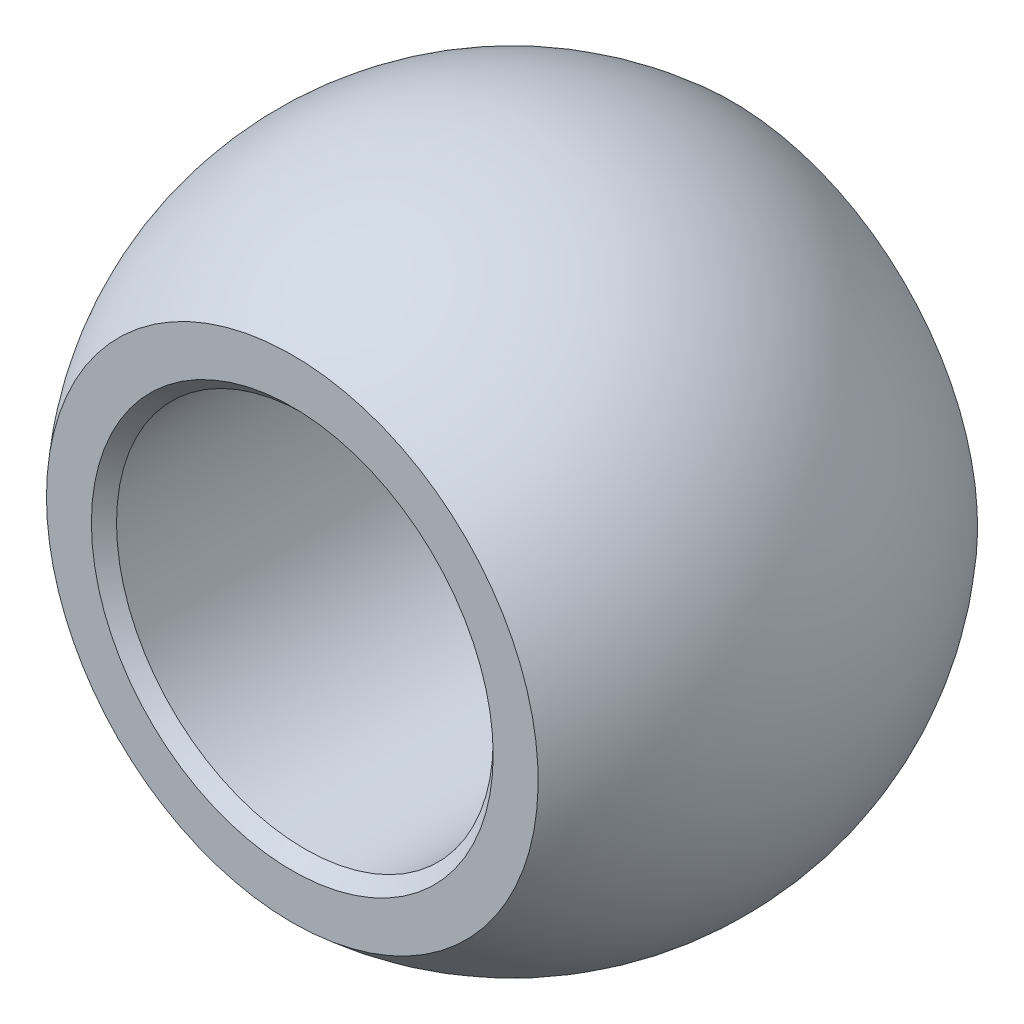
ISO-10303-21;
HEADER;
FILE_DESCRIPTION(('STEP AP214'),'2;1');
FILE_NAME('part.step','',(''),(''),'','','');
FILE_SCHEMA(('AUTOMOTIVE_DESIGN { 1 0 10303 214 1 1 1 1 }'));
ENDSEC;
DATA;
#1=APPLICATION_CONTEXT('core data for automotive mechanical design processes');
#2=APPLICATION_PROTOCOL_DEFINITION('international standard','automotive_design',2000,#1);
#3=PRODUCT_CONTEXT('',#1,'mechanical');
#4=PRODUCT('Part','Part','',(#3));
#5=PRODUCT_RELATED_PRODUCT_CATEGORY('part','',(#4));
#6=PRODUCT_DEFINITION_FORMATION('','',#4);
#7=PRODUCT_DEFINITION_CONTEXT('part definition',#1,'design');
#8=PRODUCT_DEFINITION('design','',#6,#7);
#9=PRODUCT_DEFINITION_SHAPE('','',#8);
#10=(LENGTH_UNIT() NAMED_UNIT(*) SI_UNIT(.MILLI.,.METRE.));
#11=(NAMED_UNIT(*) PLANE_ANGLE_UNIT() SI_UNIT($,.RADIAN.));
#12=(NAMED_UNIT(*) SI_UNIT($,.STERADIAN.) SOLID_ANGLE_UNIT());
#13=UNCERTAINTY_MEASURE_WITH_UNIT(LENGTH_MEASURE(1.E-05),#10,'distance_accuracy_value','');
#14=(GEOMETRIC_REPRESENTATION_CONTEXT(3) GLOBAL_UNCERTAINTY_ASSIGNED_CONTEXT((#13)) GLOBAL_UNIT_ASSIGNED_CONTEXT((#10,
#11,#12)) REPRESENTATION_CONTEXT('',''));
#15=CARTESIAN_POINT('',(0.,0.,0.));
#16=DIRECTION('',(0.,0.,1.));
#17=DIRECTION('',(1.,0.,0.));
#18=AXIS2_PLACEMENT_3D('',#15,#16,#17);
#19=CARTESIAN_POINT('',(0.,0.,0.));
#20=DIRECTION('',(0.,1.,0.));
#21=DIRECTION('',(1.,0.,0.));
#22=AXIS2_PLACEMENT_3D('',#19,#20,#21);
#23=SPHERICAL_SURFACE('',#22,16.6751);
#24=CARTESIAN_POINT('',(0.,0.,0.));
#25=DIRECTION('',(0.,0.,1.));
#26=DIRECTION('',(0.,-1.,0.));
#27=AXIS2_PLACEMENT_3D('',#24,#25,#26);
#28=SPHERICAL_SURFACE('',#27,16.6751);
#29=CARTESIAN_POINT('',(0.,0.,-11.1125));
#30=DIRECTION('',(0.,0.,1.));
#31=DIRECTION('',(0.,-1.,0.));
#32=AXIS2_PLACEMENT_3D('',#29,#30,#31);
#33=CIRCLE('',#32,12.4326708216698);
#34=CARTESIAN_POINT('',(0.,-12.4326708216698,-11.1125));
#35=VERTEX_POINT('',#34);
#36=EDGE_CURVE('E53',#35,#35,#33,.T.);
#37=ORIENTED_EDGE('',*,*,#36,.T.);
#38=EDGE_LOOP('',(#37));
#39=FACE_BOUND('',#38,.T.);
#40=CARTESIAN_POINT('',(0.,0.,11.1125));
#41=DIRECTION('',(0.,0.,-1.));
#42=DIRECTION('',(-1.,0.,0.));
#43=AXIS2_PLACEMENT_3D('',#40,#41,#42);
#44=CIRCLE('',#43,12.4326708216698);
#45=CARTESIAN_POINT('',(-12.4326708216698,0.,11.1125));
#46=VERTEX_POINT('',#45);
#47=EDGE_CURVE('E52',#46,#46,#44,.T.);
#48=ORIENTED_EDGE('',*,*,#47,.T.);
#49=EDGE_LOOP('',(#48));
#50=FACE_BOUND('',#49,.T.);
#51=ADVANCED_FACE('F32',(#39,#50),#28,.T.);
#52=CARTESIAN_POINT('',(-16.6751,50.8,11.1125));
#53=DIRECTION('',(0.,0.,-1.));
#54=DIRECTION('',(-1.,0.,0.));
#55=AXIS2_PLACEMENT_3D('',#52,#53,#54);
#56=PLANE('',#55);
#57=CARTESIAN_POINT('',(0.,0.,11.1125));
#58=DIRECTION('',(0.,0.,-1.));
#59=DIRECTION('',(-1.,0.,0.));
#60=AXIS2_PLACEMENT_3D('',#57,#58,#59);
#61=CIRCLE('',#60,10.16);
#62=CARTESIAN_POINT('',(-10.16,0.,11.1125));
#63=VERTEX_POINT('',#62);
#64=EDGE_CURVE('E39',#63,#63,#61,.T.);
#65=ORIENTED_EDGE('',*,*,#64,.T.);
#66=EDGE_LOOP('',(#65));
#67=FACE_BOUND('',#66,.T.);
#68=ORIENTED_EDGE('',*,*,#47,.F.);
#69=EDGE_LOOP('',(#68));
#70=FACE_BOUND('',#69,.T.);
#71=ADVANCED_FACE('F60',(#67,#70),#56,.F.);
#72=CARTESIAN_POINT('',(-16.6751,50.8,-11.1125));
#73=DIRECTION('',(0.,0.,1.));
#74=DIRECTION('',(0.,-1.,0.));
#75=AXIS2_PLACEMENT_3D('',#72,#73,#74);
#76=PLANE('',#75);
#77=CARTESIAN_POINT('',(0.,0.,-11.1125));
#78=DIRECTION('',(0.,0.,1.));
#79=DIRECTION('',(0.,-1.,0.));
#80=AXIS2_PLACEMENT_3D('',#77,#78,#79);
#81=CIRCLE('',#80,10.16);
#82=CARTESIAN_POINT('',(0.,-10.16,-11.1125));
#83=VERTEX_POINT('',#82);
#84=EDGE_CURVE('E10',#83,#83,#81,.T.);
#85=ORIENTED_EDGE('',*,*,#84,.T.);
#86=EDGE_LOOP('',(#85));
#87=FACE_BOUND('',#86,.T.);
#88=ORIENTED_EDGE('',*,*,#36,.F.);
#89=EDGE_LOOP('',(#88));
#90=FACE_BOUND('',#89,.T.);
#91=ADVANCED_FACE('F62',(#87,#90),#76,.F.);
#92=CARTESIAN_POINT('',(0.,0.,-11.1125));
#93=DIRECTION('',(0.,0.,1.));
#94=DIRECTION('',(1.,0.,0.));
#95=AXIS2_PLACEMENT_3D('',#92,#93,#94);
#96=CYLINDRICAL_SURFACE('',#95,9.525);
#97=CARTESIAN_POINT('',(0.,0.,10.4775));
#98=DIRECTION('',(0.,0.,-1.));
#99=DIRECTION('',(-1.,0.,0.));
#100=AXIS2_PLACEMENT_3D('',#97,#98,#99);
#101=CIRCLE('',#100,9.525);
#102=CARTESIAN_POINT('',(-9.525,0.,10.4775));
#103=VERTEX_POINT('',#102);
#104=EDGE_CURVE('E43',#103,#103,#101,.F.);
#105=ORIENTED_EDGE('',*,*,#104,.T.);
#106=EDGE_LOOP('',(#105));
#107=FACE_BOUND('',#106,.T.);
#108=CARTESIAN_POINT('',(0.,0.,-10.4775));
#109=DIRECTION('',(0.,0.,1.));
#110=DIRECTION('',(1.,0.,0.));
#111=AXIS2_PLACEMENT_3D('',#108,#109,#110);
#112=CIRCLE('',#111,9.525);
#113=CARTESIAN_POINT('',(9.525,0.,-10.4775));
#114=VERTEX_POINT('',#113);
#115=EDGE_CURVE('E47',#114,#114,#112,.F.);
#116=ORIENTED_EDGE('',*,*,#115,.T.);
#117=EDGE_LOOP('',(#116));
#118=FACE_BOUND('',#117,.T.);
#119=ADVANCED_FACE('F68',(#107,#118),#96,.F.);
#120=CARTESIAN_POINT('',(0.,0.,10.4775));
#121=DIRECTION('',(0.,0.,1.));
#122=DIRECTION('',(1.,0.,0.));
#123=AXIS2_PLACEMENT_3D('',#120,#121,#122);
#124=CONICAL_SURFACE('',#123,9.525,0.785398163397452);
#125=ORIENTED_EDGE('',*,*,#64,.F.);
#126=EDGE_LOOP('',(#125));
#127=FACE_BOUND('',#126,.T.);
#128=ORIENTED_EDGE('',*,*,#104,.F.);
#129=EDGE_LOOP('',(#128));
#130=FACE_BOUND('',#129,.T.);
#131=ADVANCED_FACE('F73',(#127,#130),#124,.F.);
#132=CARTESIAN_POINT('',(0.,0.,-11.1125));
#133=DIRECTION('',(0.,0.,-1.));
#134=DIRECTION('',(-1.,0.,0.));
#135=AXIS2_PLACEMENT_3D('',#132,#133,#134);
#136=CONICAL_SURFACE('',#135,10.16,0.785398163397448);
#137=ORIENTED_EDGE('',*,*,#115,.F.);
#138=EDGE_LOOP('',(#137));
#139=FACE_BOUND('',#138,.T.);
#140=ORIENTED_EDGE('',*,*,#84,.F.);
#141=EDGE_LOOP('',(#140));
#142=FACE_BOUND('',#141,.T.);
#143=ADVANCED_FACE('F34',(#139,#142),#136,.F.);
#144=CLOSED_SHELL('',(#51,#71,#91,#119,#131,#143));
#145=MANIFOLD_SOLID_BREP('B2',#144);
#146=ADVANCED_BREP_SHAPE_REPRESENTATION('',(#18,#145),#14);
#147=SHAPE_DEFINITION_REPRESENTATION(#9,#146);
ENDSEC;
END-ISO-10303-21;
